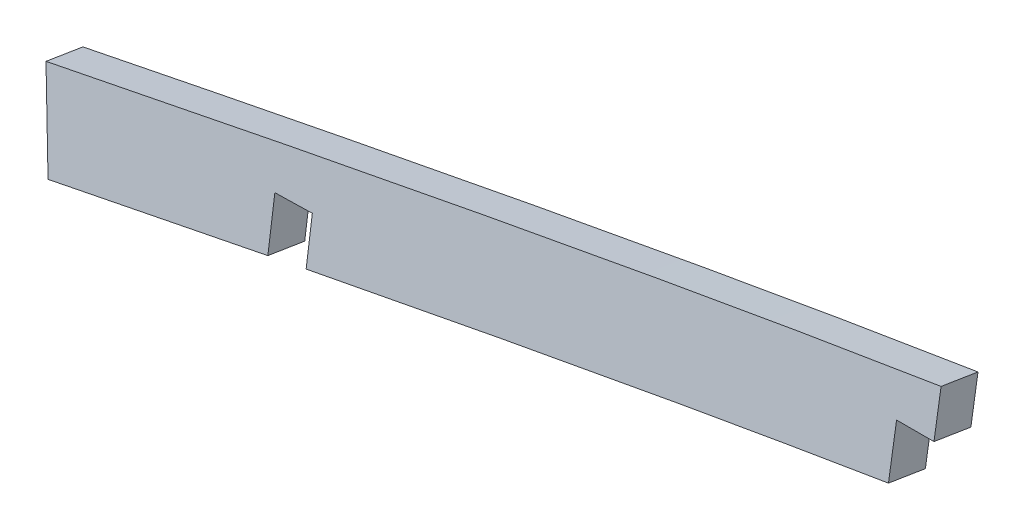
ISO-10303-21;
HEADER;
FILE_DESCRIPTION(('STEP AP214'),'2;1');
FILE_NAME('part.step','',(''),(''),'','','');
FILE_SCHEMA(('AUTOMOTIVE_DESIGN { 1 0 10303 214 1 1 1 1 }'));
ENDSEC;
DATA;
#1=APPLICATION_CONTEXT('core data for automotive mechanical design processes');
#2=APPLICATION_PROTOCOL_DEFINITION('international standard','automotive_design',2000,#1);
#3=PRODUCT_CONTEXT('',#1,'mechanical');
#4=PRODUCT('Part','Part','',(#3));
#5=PRODUCT_RELATED_PRODUCT_CATEGORY('part','',(#4));
#6=PRODUCT_DEFINITION_FORMATION('','',#4);
#7=PRODUCT_DEFINITION_CONTEXT('part definition',#1,'design');
#8=PRODUCT_DEFINITION('design','',#6,#7);
#9=PRODUCT_DEFINITION_SHAPE('','',#8);
#10=(LENGTH_UNIT() NAMED_UNIT(*) SI_UNIT(.MILLI.,.METRE.));
#11=(NAMED_UNIT(*) PLANE_ANGLE_UNIT() SI_UNIT($,.RADIAN.));
#12=(NAMED_UNIT(*) SI_UNIT($,.STERADIAN.) SOLID_ANGLE_UNIT());
#13=UNCERTAINTY_MEASURE_WITH_UNIT(LENGTH_MEASURE(1.E-05),#10,'distance_accuracy_value','');
#14=(GEOMETRIC_REPRESENTATION_CONTEXT(3) GLOBAL_UNCERTAINTY_ASSIGNED_CONTEXT((#13)) GLOBAL_UNIT_ASSIGNED_CONTEXT((#10,
#11,#12)) REPRESENTATION_CONTEXT('',''));
#15=CARTESIAN_POINT('',(0.,0.,0.));
#16=DIRECTION('',(0.,0.,1.));
#17=DIRECTION('',(1.,0.,0.));
#18=AXIS2_PLACEMENT_3D('',#15,#16,#17);
#19=CARTESIAN_POINT('',(301.717495498476,30.6119187442963,-578.100321428229));
#20=CARTESIAN_POINT('',(307.858392718691,31.7132115406812,-578.277073271585));
#21=CARTESIAN_POINT('',(320.149202014678,33.888780546782,-578.626240934751));
#22=CARTESIAN_POINT('',(338.582428282287,37.0344039524475,-579.131097351934));
#23=CARTESIAN_POINT('',(357.026051594986,40.0160885301787,-579.609642428364));
#24=CARTESIAN_POINT('',(369.31249717034,41.8474623749408,-579.903568534117));
#25=CARTESIAN_POINT('',(375.467542878121,42.7106452141205,-580.042104951025));
#26=B_SPLINE_CURVE_WITH_KNOTS('',3,(#19,#20,#21,#22,#23,#24,#25),.UNSPECIFIED.,.F.,.F.,(4,1,1,1,
4),(0.,0.171703577544562,0.343407155089124,0.515110732633687,0.686814310178249),.UNSPECIFIED.);
#27=DIRECTION('',(0.,-0.158466902588745,-0.98736428980591));
#28=VECTOR('',#27,1.);
#29=SURFACE_OF_LINEAR_EXTRUSION('',#26,#28);
#30=CARTESIAN_POINT('',(301.717495498476,30.108786328577,-581.235203048363));
#31=CARTESIAN_POINT('',(307.858392718691,31.210079124962,-581.411954891718));
#32=CARTESIAN_POINT('',(320.149202014678,33.3856481310628,-581.761122554884));
#33=CARTESIAN_POINT('',(338.582428282287,36.5312715367283,-582.265978972068));
#34=CARTESIAN_POINT('',(357.026051594986,39.5129561144594,-582.744524048498));
#35=CARTESIAN_POINT('',(369.31249717034,41.3443299592215,-583.03845015425));
#36=CARTESIAN_POINT('',(375.467542878121,42.2075127984012,-583.176986571158));
#37=B_SPLINE_CURVE_WITH_KNOTS('',3,(#30,#31,#32,#33,#34,#35,#36),.UNSPECIFIED.,.F.,.F.,(4,1,1,1,
4),(0.,0.171703577544562,0.343407155089124,0.515110732633687,0.686814310178249),.UNSPECIFIED.);
#38=CARTESIAN_POINT('',(301.717495498476,30.1087863285771,-581.235203048363));
#39=VERTEX_POINT('',#38);
#40=CARTESIAN_POINT('',(319.861053503247,33.3160101958002,-581.749946023532));
#41=VERTEX_POINT('',#40);
#42=EDGE_CURVE('E136',#39,#41,#37,.T.);
#43=ORIENTED_EDGE('',*,*,#42,.T.);
#44=DIRECTION('',(0.,-0.158466902588134,-0.987364289806008));
#45=VECTOR('',#44,1.);
#46=CARTESIAN_POINT('',(319.861053503247,34.3101481364097,-575.555742150876));
#47=LINE('',#46,#45);
#48=CARTESIAN_POINT('',(319.861053503247,33.8191426115114,-578.615064403436));
#49=VERTEX_POINT('',#48);
#50=EDGE_CURVE('E240',#49,#41,#47,.T.);
#51=ORIENTED_EDGE('',*,*,#50,.F.);
#52=CARTESIAN_POINT('',(301.717495498476,30.6119187442963,-578.100321428229));
#53=VERTEX_POINT('',#52);
#54=EDGE_CURVE('E118',#53,#49,#26,.T.);
#55=ORIENTED_EDGE('',*,*,#54,.F.);
#56=DIRECTION('',(0.,-0.158466902588745,-0.98736428980591));
#57=VECTOR('',#56,1.);
#58=CARTESIAN_POINT('',(301.717495498476,30.6119187442963,-578.100321428229));
#59=LINE('',#58,#57);
#60=EDGE_CURVE('E44',#53,#39,#59,.T.);
#61=ORIENTED_EDGE('',*,*,#60,.T.);
#62=EDGE_LOOP('',(#43,#51,#55,#61));
#63=FACE_BOUND('',#62,.T.);
#64=ADVANCED_FACE('F33',(#63),#29,.F.);
#65=CARTESIAN_POINT('',(374.396000000001,50.1595756912702,-581.237620073964));
#66=CARTESIAN_POINT('',(365.378247240586,48.8949301563187,-581.034650954191));
#67=CARTESIAN_POINT('',(356.378821901283,47.5177836183248,-580.813626000646));
#68=CARTESIAN_POINT('',(338.401992935169,44.6283125015266,-580.349880711571));
#69=CARTESIAN_POINT('',(329.4246703583,43.1153386212594,-580.107056166487));
#70=CARTESIAN_POINT('',(313.750786531524,40.3998374362161,-579.671232158861));
#71=CARTESIAN_POINT('',(307.051747758843,39.2153615819684,-579.481129861511));
#72=CARTESIAN_POINT('',(300.355738534569,38.0145186615164,-579.28840073401));
#73=B_SPLINE_CURVE_WITH_KNOTS('',3,(#65,#66,#67,#68,#69,#70,#71,#72),.UNSPECIFIED.,.F.,.F.,(4,2,
2,4),(0.,0.25,0.5,0.686814310178249),.UNSPECIFIED.);
#74=DIRECTION('',(0.,-0.158466902588745,-0.98736428980591));
#75=VECTOR('',#74,1.);
#76=SURFACE_OF_LINEAR_EXTRUSION('',#73,#75);
#77=CARTESIAN_POINT('',(374.396000000001,49.6564432755509,-584.372501694097));
#78=CARTESIAN_POINT('',(365.378247240586,48.3917977405995,-584.169532574325));
#79=CARTESIAN_POINT('',(356.378821901283,47.0146512026055,-583.94850762078));
#80=CARTESIAN_POINT('',(338.401992935169,44.1251800858073,-583.484762331704));
#81=CARTESIAN_POINT('',(329.4246703583,42.6122062055401,-583.241937786621));
#82=CARTESIAN_POINT('',(313.750786531524,39.8967050204969,-582.806113778995));
#83=CARTESIAN_POINT('',(307.051747758843,38.7122291662491,-582.616011481645));
#84=CARTESIAN_POINT('',(300.355738534569,37.5113862457972,-582.423282354144));
#85=B_SPLINE_CURVE_WITH_KNOTS('',3,(#77,#78,#79,#80,#81,#82,#83,#84),.UNSPECIFIED.,.F.,.F.,(4,2,
2,4),(0.,0.25,0.5,0.686814310178249),.UNSPECIFIED.);
#86=CARTESIAN_POINT('',(374.396000000001,49.6564432755509,-584.372501694097));
#87=VERTEX_POINT('',#86);
#88=CARTESIAN_POINT('',(300.355738534569,37.5113862457972,-582.423282354144));
#89=VERTEX_POINT('',#88);
#90=EDGE_CURVE('E194',#87,#89,#85,.T.);
#91=ORIENTED_EDGE('',*,*,#90,.T.);
#92=DIRECTION('',(0.,-0.158466902588745,-0.98736428980591));
#93=VECTOR('',#92,1.);
#94=CARTESIAN_POINT('',(300.355738534569,38.0145186615165,-579.28840073401));
#95=LINE('',#94,#93);
#96=CARTESIAN_POINT('',(300.355738534569,38.0145186615165,-579.28840073401));
#97=VERTEX_POINT('',#96);
#98=EDGE_CURVE('E11',#97,#89,#95,.T.);
#99=ORIENTED_EDGE('',*,*,#98,.F.);
#100=CARTESIAN_POINT('',(300.355738534569,38.0145186615164,-579.28840073401));
#101=CARTESIAN_POINT('',(307.051747758843,39.2153615819684,-579.481129861511));
#102=CARTESIAN_POINT('',(313.750786531524,40.3998374362161,-579.671232158861));
#103=CARTESIAN_POINT('',(329.4246703583,43.1153386212594,-580.107056166487));
#104=CARTESIAN_POINT('',(338.401992935169,44.6283125015266,-580.349880711571));
#105=CARTESIAN_POINT('',(356.378821901283,47.5177836183248,-580.813626000646));
#106=CARTESIAN_POINT('',(365.378247240586,48.8949301563187,-581.034650954191));
#107=CARTESIAN_POINT('',(374.396000000001,50.1595756912702,-581.237620073964));
#108=B_SPLINE_CURVE_WITH_KNOTS('',3,(#100,#101,#102,#103,#104,#105,#106,#107),.UNSPECIFIED.,.F.,
.F.,(4,2,2,4),(0.,0.186814310178249,0.436814310178249,0.686814310178249),.UNSPECIFIED.);
#109=CARTESIAN_POINT('',(374.396000000001,50.1595756912702,-581.237620073964));
#110=VERTEX_POINT('',#109);
#111=EDGE_CURVE('E154',#110,#97,#108,.F.);
#112=ORIENTED_EDGE('',*,*,#111,.F.);
#113=DIRECTION('',(0.,-0.158466902588745,-0.98736428980591));
#114=VECTOR('',#113,1.);
#115=CARTESIAN_POINT('',(374.396000000001,50.1595756912702,-581.237620073964));
#116=LINE('',#115,#114);
#117=EDGE_CURVE('E132',#110,#87,#116,.T.);
#118=ORIENTED_EDGE('',*,*,#117,.T.);
#119=EDGE_LOOP('',(#91,#99,#112,#118));
#120=FACE_BOUND('',#119,.T.);
#121=ADVANCED_FACE('F35',(#120),#76,.F.);
#122=CARTESIAN_POINT('',(300.355738534569,38.0145186615165,-579.28840073401));
#123=DIRECTION('',(0.983902107296616,0.17645015715956,-0.0283193449014337));
#124=DIRECTION('',(-0.176520954962232,0.984296882276492,0.));
#125=AXIS2_PLACEMENT_3D('',#122,#123,#124);
#126=PLANE('',#125);
#127=DIRECTION('',(0.178708262979862,-0.971469805409461,0.155915919393834));
#128=VECTOR('',#127,1.);
#129=CARTESIAN_POINT('',(300.355738534569,37.5113862457972,-582.423282354144));
#130=LINE('',#129,#128);
#131=EDGE_CURVE('E193',#89,#39,#130,.T.);
#132=ORIENTED_EDGE('',*,*,#131,.T.);
#133=ORIENTED_EDGE('',*,*,#60,.F.);
#134=DIRECTION('',(0.178708262979862,-0.971469805409461,0.155915919393834));
#135=VECTOR('',#134,1.);
#136=CARTESIAN_POINT('',(300.355738534569,38.0145186615165,-579.28840073401));
#137=LINE('',#136,#135);
#138=EDGE_CURVE('E96',#97,#53,#137,.T.);
#139=ORIENTED_EDGE('',*,*,#138,.F.);
#140=ORIENTED_EDGE('',*,*,#98,.T.);
#141=EDGE_LOOP('',(#132,#133,#139,#140));
#142=FACE_BOUND('',#141,.T.);
#143=ADVANCED_FACE('F224',(#142),#126,.F.);
#144=CARTESIAN_POINT('',(323.025447556167,34.3677623192918,-578.703115051701));
#145=VERTEX_POINT('',#144);
#146=CARTESIAN_POINT('',(371.221,42.1066972645509,-579.945174403828));
#147=VERTEX_POINT('',#146);
#148=EDGE_CURVE('E114',#145,#147,#26,.T.);
#149=ORIENTED_EDGE('',*,*,#148,.F.);
#150=DIRECTION('',(0.,-0.158466902588134,-0.987364289806008));
#151=VECTOR('',#150,1.);
#152=CARTESIAN_POINT('',(323.025447556167,34.8587678441902,-575.643792799141));
#153=LINE('',#152,#151);
#154=CARTESIAN_POINT('',(323.025447556167,33.8646299035806,-581.837996671797));
#155=VERTEX_POINT('',#154);
#156=EDGE_CURVE('E253',#145,#155,#153,.T.);
#157=ORIENTED_EDGE('',*,*,#156,.T.);
#158=CARTESIAN_POINT('',(371.221,41.6035648488317,-583.080056023962));
#159=VERTEX_POINT('',#158);
#160=EDGE_CURVE('E141',#155,#159,#37,.T.);
#161=ORIENTED_EDGE('',*,*,#160,.T.);
#162=DIRECTION('',(0.,-0.158466902588745,-0.98736428980591));
#163=VECTOR('',#162,1.);
#164=CARTESIAN_POINT('',(371.221,42.1066972645509,-579.945174403828));
#165=LINE('',#164,#163);
#166=EDGE_CURVE('E127',#147,#159,#165,.T.);
#167=ORIENTED_EDGE('',*,*,#166,.F.);
#168=EDGE_LOOP('',(#149,#157,#161,#167));
#169=FACE_BOUND('',#168,.T.);
#170=ADVANCED_FACE('F221',(#169),#29,.F.);
#171=CARTESIAN_POINT('',(371.221000000001,46.4028023969174,-580.634677235307));
#172=DIRECTION('',(-1.,0.,0.));
#173=DIRECTION('',(0.,-1.,0.));
#174=AXIS2_PLACEMENT_3D('',#171,#172,#173);
#175=PLANE('',#174);
#176=DIRECTION('',(0.,0.98736428980591,-0.158466902588748));
#177=VECTOR('',#176,1.);
#178=CARTESIAN_POINT('',(371.221000000001,45.8996699811981,-583.76955885544));
#179=LINE('',#178,#177);
#180=CARTESIAN_POINT('',(371.221000000001,45.8996699811981,-583.76955885544));
#181=VERTEX_POINT('',#180);
#182=EDGE_CURVE('E124',#159,#181,#179,.T.);
#183=ORIENTED_EDGE('',*,*,#182,.T.);
#184=DIRECTION('',(0.,-0.158466902588745,-0.98736428980591));
#185=VECTOR('',#184,1.);
#186=CARTESIAN_POINT('',(371.221000000001,46.4028023969174,-580.634677235307));
#187=LINE('',#186,#185);
#188=CARTESIAN_POINT('',(371.221000000001,46.4028023969174,-580.634677235307));
#189=VERTEX_POINT('',#188);
#190=EDGE_CURVE('E121',#189,#181,#187,.T.);
#191=ORIENTED_EDGE('',*,*,#190,.F.);
#192=DIRECTION('',(0.,0.98736428980591,-0.158466902588748));
#193=VECTOR('',#192,1.);
#194=CARTESIAN_POINT('',(371.221000000001,46.4028023969174,-580.634677235307));
#195=LINE('',#194,#193);
#196=EDGE_CURVE('E105',#147,#189,#195,.T.);
#197=ORIENTED_EDGE('',*,*,#196,.F.);
#198=ORIENTED_EDGE('',*,*,#166,.T.);
#199=EDGE_LOOP('',(#183,#191,#197,#198));
#200=FACE_BOUND('',#199,.T.);
#201=ADVANCED_FACE('F122',(#200),#175,.F.);
#202=CARTESIAN_POINT('',(371.221000000001,46.4028023969174,-580.634677235307));
#203=DIRECTION('',(0.,0.98736428980591,-0.158466902588745));
#204=DIRECTION('',(0.,0.158466902588745,0.98736428980591));
#205=AXIS2_PLACEMENT_3D('',#202,#203,#204);
#206=PLANE('',#205);
#207=DIRECTION('',(1.,0.,0.));
#208=VECTOR('',#207,1.);
#209=CARTESIAN_POINT('',(371.221000000001,45.8996699811981,-583.76955885544));
#210=LINE('',#209,#208);
#211=CARTESIAN_POINT('',(374.396000000001,45.8996699811981,-583.76955885544));
#212=VERTEX_POINT('',#211);
#213=EDGE_CURVE('E146',#181,#212,#210,.T.);
#214=ORIENTED_EDGE('',*,*,#213,.T.);
#215=DIRECTION('',(0.,-0.158466902588745,-0.98736428980591));
#216=VECTOR('',#215,1.);
#217=CARTESIAN_POINT('',(374.396000000001,46.4028023969174,-580.634677235307));
#218=LINE('',#217,#216);
#219=CARTESIAN_POINT('',(374.396000000001,46.4028023969174,-580.634677235307));
#220=VERTEX_POINT('',#219);
#221=EDGE_CURVE('E128',#220,#212,#218,.T.);
#222=ORIENTED_EDGE('',*,*,#221,.F.);
#223=DIRECTION('',(1.,0.,0.));
#224=VECTOR('',#223,1.);
#225=CARTESIAN_POINT('',(371.221000000001,46.4028023969174,-580.634677235307));
#226=LINE('',#225,#224);
#227=EDGE_CURVE('E110',#189,#220,#226,.T.);
#228=ORIENTED_EDGE('',*,*,#227,.F.);
#229=ORIENTED_EDGE('',*,*,#190,.T.);
#230=EDGE_LOOP('',(#214,#222,#228,#229));
#231=FACE_BOUND('',#230,.T.);
#232=ADVANCED_FACE('F130',(#231),#206,.F.);
#233=CARTESIAN_POINT('',(374.396000000001,46.4028023969174,-580.634677235307));
#234=DIRECTION('',(-1.,0.,0.));
#235=DIRECTION('',(0.,-1.,0.));
#236=AXIS2_PLACEMENT_3D('',#233,#234,#235);
#237=PLANE('',#236);
#238=DIRECTION('',(0.,0.987364289805912,-0.158466902588732));
#239=VECTOR('',#238,1.);
#240=CARTESIAN_POINT('',(374.396000000001,45.8996699811981,-583.76955885544));
#241=LINE('',#240,#239);
#242=EDGE_CURVE('E88',#212,#87,#241,.T.);
#243=ORIENTED_EDGE('',*,*,#242,.T.);
#244=ORIENTED_EDGE('',*,*,#117,.F.);
#245=DIRECTION('',(0.,0.987364289805912,-0.158466902588732));
#246=VECTOR('',#245,1.);
#247=CARTESIAN_POINT('',(374.396000000001,46.4028023969174,-580.634677235307));
#248=LINE('',#247,#246);
#249=EDGE_CURVE('E61',#220,#110,#248,.T.);
#250=ORIENTED_EDGE('',*,*,#249,.F.);
#251=ORIENTED_EDGE('',*,*,#221,.T.);
#252=EDGE_LOOP('',(#243,#244,#250,#251));
#253=FACE_BOUND('',#252,.T.);
#254=ADVANCED_FACE('F171',(#253),#237,.F.);
#255=CARTESIAN_POINT('',(337.31983990089,44.4264979974554,-580.317490519128));
#256=DIRECTION('',(0.,-0.158466902588626,-0.987364289805929));
#257=DIRECTION('',(0.,0.987364289805929,-0.158466902588626));
#258=AXIS2_PLACEMENT_3D('',#255,#256,#257);
#259=PLANE('',#258);
#260=ORIENTED_EDGE('',*,*,#54,.T.);
#261=DIRECTION('',(-0.0203132358768291,0.987160561933015,-0.1584342053103));
#262=VECTOR('',#261,1.);
#263=CARTESIAN_POINT('',(319.650075340226,44.0720300995562,-580.260600240203));
#264=LINE('',#263,#262);
#265=CARTESIAN_POINT('',(319.773665288318,38.0659401123317,-579.296653613036));
#266=VERTEX_POINT('',#265);
#267=EDGE_CURVE('E200',#49,#266,#264,.T.);
#268=ORIENTED_EDGE('',*,*,#267,.T.);
#269=DIRECTION('',(0.999793664936945,0.0200565637191652,-0.00321897557161049));
#270=VECTOR('',#269,1.);
#271=CARTESIAN_POINT('',(337.443429849006,38.4204080103018,-579.353543891972));
#272=LINE('',#271,#270);
#273=CARTESIAN_POINT('',(322.948038155187,38.1296202634524,-579.306873950563));
#274=VERTEX_POINT('',#273);
#275=EDGE_CURVE('E196',#266,#274,#272,.T.);
#276=ORIENTED_EDGE('',*,*,#275,.T.);
#277=DIRECTION('',(0.0203132358808781,-0.987160561932934,0.158434205310287));
#278=VECTOR('',#277,1.);
#279=CARTESIAN_POINT('',(322.824448207072,44.1357102506058,-580.27082057772));
#280=LINE('',#279,#278);
#281=EDGE_CURVE('E205',#274,#145,#280,.T.);
#282=ORIENTED_EDGE('',*,*,#281,.T.);
#283=ORIENTED_EDGE('',*,*,#148,.T.);
#284=ORIENTED_EDGE('',*,*,#196,.T.);
#285=ORIENTED_EDGE('',*,*,#227,.T.);
#286=ORIENTED_EDGE('',*,*,#249,.T.);
#287=ORIENTED_EDGE('',*,*,#111,.T.);
#288=ORIENTED_EDGE('',*,*,#138,.T.);
#289=EDGE_LOOP('',(#260,#268,#276,#282,#283,#284,#285,#286,#287,#288));
#290=FACE_BOUND('',#289,.T.);
#291=ADVANCED_FACE('F108',(#290),#259,.F.);
#292=CARTESIAN_POINT('',(337.31983990089,43.9233655817362,-583.452372139262));
#293=DIRECTION('',(0.,-0.158466902588626,-0.987364289805929));
#294=DIRECTION('',(0.,0.987364289805929,-0.158466902588626));
#295=AXIS2_PLACEMENT_3D('',#292,#293,#294);
#296=PLANE('',#295);
#297=DIRECTION('',(-0.0203132358768291,0.987160561933093,-0.158434205309816));
#298=VECTOR('',#297,1.);
#299=CARTESIAN_POINT('',(319.773665288318,37.5628076966208,-582.43153523313));
#300=LINE('',#299,#298);
#301=CARTESIAN_POINT('',(319.773665288318,37.5628076966208,-582.43153523313));
#302=VERTEX_POINT('',#301);
#303=EDGE_CURVE('E246',#41,#302,#300,.T.);
#304=ORIENTED_EDGE('',*,*,#303,.F.);
#305=ORIENTED_EDGE('',*,*,#42,.F.);
#306=ORIENTED_EDGE('',*,*,#131,.F.);
#307=ORIENTED_EDGE('',*,*,#90,.F.);
#308=ORIENTED_EDGE('',*,*,#242,.F.);
#309=ORIENTED_EDGE('',*,*,#213,.F.);
#310=ORIENTED_EDGE('',*,*,#182,.F.);
#311=ORIENTED_EDGE('',*,*,#160,.F.);
#312=DIRECTION('',(0.0203132358808781,-0.987160561933013,0.158434205309792));
#313=VECTOR('',#312,1.);
#314=CARTESIAN_POINT('',(322.948038155187,37.6264878477415,-582.441755570658));
#315=LINE('',#314,#313);
#316=CARTESIAN_POINT('',(322.948038155192,37.6264878474857,-582.441755570658));
#317=VERTEX_POINT('',#316);
#318=EDGE_CURVE('E251',#317,#155,#315,.T.);
#319=ORIENTED_EDGE('',*,*,#318,.F.);
#320=DIRECTION('',(0.999793664936945,0.020056563719154,-0.00321897557168021));
#321=VECTOR('',#320,1.);
#322=CARTESIAN_POINT('',(322.948038155187,37.6264878477415,-582.441755570658));
#323=LINE('',#322,#321);
#324=EDGE_CURVE('E52',#302,#317,#323,.T.);
#325=ORIENTED_EDGE('',*,*,#324,.F.);
#326=EDGE_LOOP('',(#304,#305,#306,#307,#308,#309,#310,#311,#319,#325));
#327=FACE_BOUND('',#326,.T.);
#328=ADVANCED_FACE('F170',(#327),#296,.T.);
#329=CARTESIAN_POINT('',(322.948038155187,38.6206257883511,-576.247551698002));
#330=DIRECTION('',(-0.0203132358808625,0.987160561933013,-0.158434205309795));
#331=DIRECTION('',(0.,0.158466902588132,0.987364289806008));
#332=AXIS2_PLACEMENT_3D('',#329,#330,#331);
#333=PLANE('',#332);
#334=DIRECTION('',(0.,-0.158466902588134,-0.987364289806008));
#335=VECTOR('',#334,1.);
#336=CARTESIAN_POINT('',(319.773665288318,38.5569456372303,-576.237331360474));
#337=LINE('',#336,#335);
#338=EDGE_CURVE('E259',#266,#302,#337,.T.);
#339=ORIENTED_EDGE('',*,*,#338,.T.);
#340=ORIENTED_EDGE('',*,*,#324,.T.);
#341=DIRECTION('',(0.,-0.158466902588134,-0.987364289806008));
#342=VECTOR('',#341,1.);
#343=CARTESIAN_POINT('',(322.948038155187,38.6206257883511,-576.247551698002));
#344=LINE('',#343,#342);
#345=EDGE_CURVE('E250',#274,#317,#344,.T.);
#346=ORIENTED_EDGE('',*,*,#345,.F.);
#347=ORIENTED_EDGE('',*,*,#275,.F.);
#348=EDGE_LOOP('',(#339,#340,#346,#347));
#349=FACE_BOUND('',#348,.T.);
#350=ADVANCED_FACE('F172',(#349),#333,.F.);
#351=CARTESIAN_POINT('',(319.773665288318,38.5569456372303,-576.237331360474));
#352=DIRECTION('',(-0.999793664937027,-0.0200565637151729,0.00321897557103321));
#353=DIRECTION('',(0.0200566676270688,-0.999798844810144,0.));
#354=AXIS2_PLACEMENT_3D('',#351,#352,#353);
#355=PLANE('',#354);
#356=ORIENTED_EDGE('',*,*,#50,.T.);
#357=ORIENTED_EDGE('',*,*,#303,.T.);
#358=ORIENTED_EDGE('',*,*,#338,.F.);
#359=ORIENTED_EDGE('',*,*,#267,.F.);
#360=EDGE_LOOP('',(#356,#357,#358,#359));
#361=FACE_BOUND('',#360,.T.);
#362=ADVANCED_FACE('F331',(#361),#355,.F.);
#363=CARTESIAN_POINT('',(322.948038155187,38.6206257883511,-576.247551698002));
#364=DIRECTION('',(0.999793664936945,0.0200565637191707,-0.00321897557167484));
#365=DIRECTION('',(-0.0200566676310666,0.999798844810063,0.));
#366=AXIS2_PLACEMENT_3D('',#363,#364,#365);
#367=PLANE('',#366);
#368=ORIENTED_EDGE('',*,*,#345,.T.);
#369=ORIENTED_EDGE('',*,*,#318,.T.);
#370=ORIENTED_EDGE('',*,*,#156,.F.);
#371=ORIENTED_EDGE('',*,*,#281,.F.);
#372=EDGE_LOOP('',(#368,#369,#370,#371));
#373=FACE_BOUND('',#372,.T.);
#374=ADVANCED_FACE('F339',(#373),#367,.F.);
#375=CLOSED_SHELL('',(#64,#121,#143,#170,#201,#232,#254,#291,#328,#350,#362,#374));
#376=MANIFOLD_SOLID_BREP('B2',#375);
#377=ADVANCED_BREP_SHAPE_REPRESENTATION('',(#18,#376),#14);
#378=SHAPE_DEFINITION_REPRESENTATION(#9,#377);
ENDSEC;
END-ISO-10303-21;
